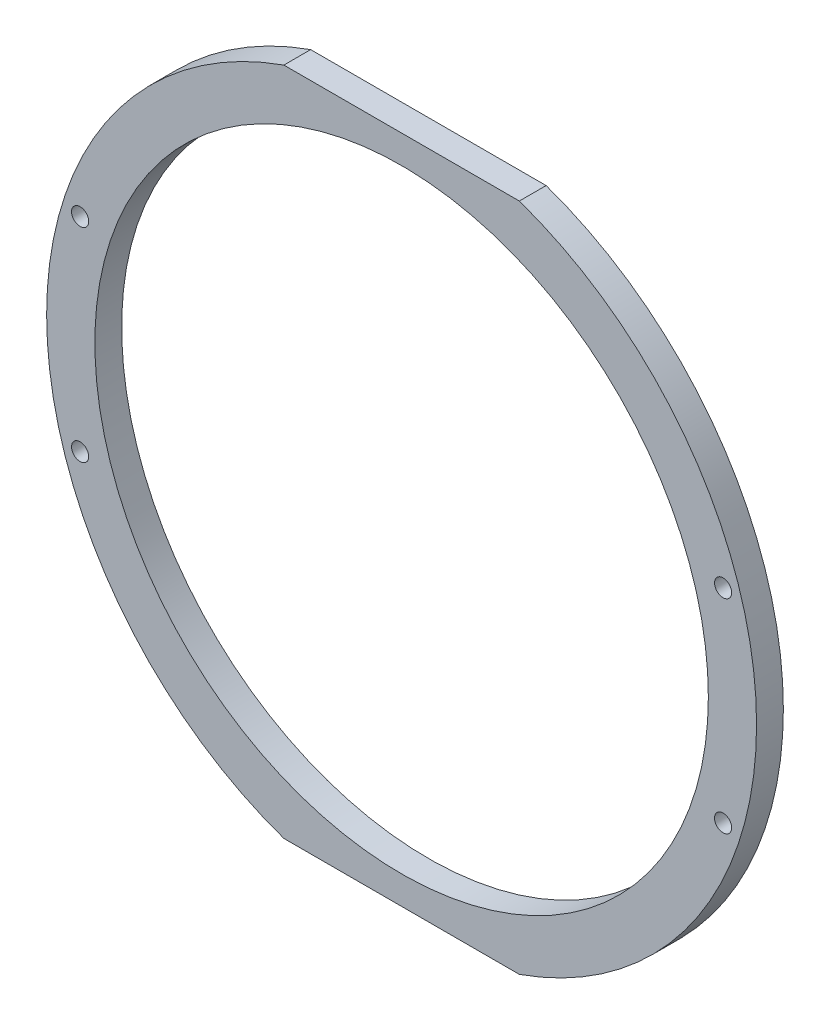
ISO-10303-21;
HEADER;
FILE_DESCRIPTION(('STEP AP214'),'2;1');
FILE_NAME('part.step','',(''),(''),'','','');
FILE_SCHEMA(('AUTOMOTIVE_DESIGN { 1 0 10303 214 1 1 1 1 }'));
ENDSEC;
DATA;
#1=APPLICATION_CONTEXT('core data for automotive mechanical design processes');
#2=APPLICATION_PROTOCOL_DEFINITION('international standard','automotive_design',2000,#1);
#3=PRODUCT_CONTEXT('',#1,'mechanical');
#4=PRODUCT('Part','Part','',(#3));
#5=PRODUCT_RELATED_PRODUCT_CATEGORY('part','',(#4));
#6=PRODUCT_DEFINITION_FORMATION('','',#4);
#7=PRODUCT_DEFINITION_CONTEXT('part definition',#1,'design');
#8=PRODUCT_DEFINITION('design','',#6,#7);
#9=PRODUCT_DEFINITION_SHAPE('','',#8);
#10=(LENGTH_UNIT() NAMED_UNIT(*) SI_UNIT(.MILLI.,.METRE.));
#11=(NAMED_UNIT(*) PLANE_ANGLE_UNIT() SI_UNIT($,.RADIAN.));
#12=(NAMED_UNIT(*) SI_UNIT($,.STERADIAN.) SOLID_ANGLE_UNIT());
#13=UNCERTAINTY_MEASURE_WITH_UNIT(LENGTH_MEASURE(1.E-05),#10,'distance_accuracy_value','');
#14=(GEOMETRIC_REPRESENTATION_CONTEXT(3) GLOBAL_UNCERTAINTY_ASSIGNED_CONTEXT((#13)) GLOBAL_UNIT_ASSIGNED_CONTEXT((#10,
#11,#12)) REPRESENTATION_CONTEXT('',''));
#15=CARTESIAN_POINT('',(0.,0.,0.));
#16=DIRECTION('',(0.,0.,1.));
#17=DIRECTION('',(1.,0.,0.));
#18=AXIS2_PLACEMENT_3D('',#15,#16,#17);
#19=CARTESIAN_POINT('',(0.,0.,5.));
#20=DIRECTION('',(0.,0.,1.));
#21=DIRECTION('',(1.,0.,0.));
#22=AXIS2_PLACEMENT_3D('',#19,#20,#21);
#23=PLANE('',#22);
#24=CARTESIAN_POINT('',(-60.0000000000001,19.,5.));
#25=DIRECTION('',(0.,0.,1.));
#26=DIRECTION('',(1.,0.,0.));
#27=AXIS2_PLACEMENT_3D('',#24,#25,#26);
#28=CIRCLE('',#27,1.60000000000015);
#29=CARTESIAN_POINT('',(-58.4,19.,5.));
#30=VERTEX_POINT('',#29);
#31=EDGE_CURVE('E128',#30,#30,#28,.T.);
#32=ORIENTED_EDGE('',*,*,#31,.F.);
#33=EDGE_LOOP('',(#32));
#34=FACE_BOUND('',#33,.T.);
#35=CARTESIAN_POINT('',(60.,-19.,5.));
#36=DIRECTION('',(0.,0.,1.));
#37=DIRECTION('',(1.,0.,0.));
#38=AXIS2_PLACEMENT_3D('',#35,#36,#37);
#39=CIRCLE('',#38,1.6);
#40=CARTESIAN_POINT('',(61.6,-19.,5.));
#41=VERTEX_POINT('',#40);
#42=EDGE_CURVE('E116',#41,#41,#39,.T.);
#43=ORIENTED_EDGE('',*,*,#42,.F.);
#44=EDGE_LOOP('',(#43));
#45=FACE_BOUND('',#44,.T.);
#46=CARTESIAN_POINT('',(0.,0.,5.));
#47=DIRECTION('',(0.,0.,1.));
#48=DIRECTION('',(1.,0.,0.));
#49=AXIS2_PLACEMENT_3D('',#46,#47,#48);
#50=CIRCLE('',#49,66.25);
#51=CARTESIAN_POINT('',(-21.9729947890586,62.5,5.));
#52=VERTEX_POINT('',#51);
#53=CARTESIAN_POINT('',(-21.9729947890586,-62.5,5.));
#54=VERTEX_POINT('',#53);
#55=EDGE_CURVE('E86',#52,#54,#50,.T.);
#56=ORIENTED_EDGE('',*,*,#55,.T.);
#57=DIRECTION('',(1.,0.,0.));
#58=VECTOR('',#57,1.);
#59=CARTESIAN_POINT('',(-21.9729947890586,-62.5,5.));
#60=LINE('',#59,#58);
#61=CARTESIAN_POINT('',(21.9729947890587,-62.5,5.));
#62=VERTEX_POINT('',#61);
#63=EDGE_CURVE('E81',#54,#62,#60,.T.);
#64=ORIENTED_EDGE('',*,*,#63,.T.);
#65=CARTESIAN_POINT('',(0.,0.,5.));
#66=DIRECTION('',(0.,0.,1.));
#67=DIRECTION('',(-1.,0.,0.));
#68=AXIS2_PLACEMENT_3D('',#65,#66,#67);
#69=CIRCLE('',#68,66.25);
#70=CARTESIAN_POINT('',(21.9729947890586,62.5,5.));
#71=VERTEX_POINT('',#70);
#72=EDGE_CURVE('E84',#62,#71,#69,.T.);
#73=ORIENTED_EDGE('',*,*,#72,.T.);
#74=DIRECTION('',(-1.,0.,0.));
#75=VECTOR('',#74,1.);
#76=CARTESIAN_POINT('',(-21.9729947890586,62.5,5.));
#77=LINE('',#76,#75);
#78=EDGE_CURVE('E51',#71,#52,#77,.T.);
#79=ORIENTED_EDGE('',*,*,#78,.T.);
#80=EDGE_LOOP('',(#56,#64,#73,#79));
#81=FACE_BOUND('',#80,.T.);
#82=CARTESIAN_POINT('',(59.9999999999999,19.,5.));
#83=DIRECTION('',(0.,0.,1.));
#84=DIRECTION('',(1.,0.,0.));
#85=AXIS2_PLACEMENT_3D('',#82,#83,#84);
#86=CIRCLE('',#85,1.60000000000013);
#87=CARTESIAN_POINT('',(61.6,19.,5.));
#88=VERTEX_POINT('',#87);
#89=EDGE_CURVE('E101',#88,#88,#86,.T.);
#90=ORIENTED_EDGE('',*,*,#89,.F.);
#91=EDGE_LOOP('',(#90));
#92=FACE_BOUND('',#91,.T.);
#93=CARTESIAN_POINT('',(-60.,-19.,5.));
#94=DIRECTION('',(0.,0.,1.));
#95=DIRECTION('',(1.,0.,0.));
#96=AXIS2_PLACEMENT_3D('',#93,#94,#95);
#97=CIRCLE('',#96,1.6);
#98=CARTESIAN_POINT('',(-58.4,-19.,5.));
#99=VERTEX_POINT('',#98);
#100=EDGE_CURVE('E122',#99,#99,#97,.T.);
#101=ORIENTED_EDGE('',*,*,#100,.F.);
#102=EDGE_LOOP('',(#101));
#103=FACE_BOUND('',#102,.T.);
#104=CARTESIAN_POINT('',(0.,0.,5.));
#105=DIRECTION('',(0.,0.,1.));
#106=DIRECTION('',(1.,0.,0.));
#107=AXIS2_PLACEMENT_3D('',#104,#105,#106);
#108=CIRCLE('',#107,57.25);
#109=CARTESIAN_POINT('',(57.25,0.,5.));
#110=VERTEX_POINT('',#109);
#111=EDGE_CURVE('E134',#110,#110,#108,.T.);
#112=ORIENTED_EDGE('',*,*,#111,.F.);
#113=EDGE_LOOP('',(#112));
#114=FACE_BOUND('',#113,.T.);
#115=ADVANCED_FACE('F34',(#34,#45,#81,#92,#103,#114),#23,.T.);
#116=CARTESIAN_POINT('',(0.,0.,0.));
#117=DIRECTION('',(0.,0.,1.));
#118=DIRECTION('',(1.,0.,0.));
#119=AXIS2_PLACEMENT_3D('',#116,#117,#118);
#120=PLANE('',#119);
#121=CARTESIAN_POINT('',(0.,0.,0.));
#122=DIRECTION('',(0.,0.,1.));
#123=DIRECTION('',(1.,0.,0.));
#124=AXIS2_PLACEMENT_3D('',#121,#122,#123);
#125=CIRCLE('',#124,66.25);
#126=CARTESIAN_POINT('',(-21.9729947890586,62.5,0.));
#127=VERTEX_POINT('',#126);
#128=CARTESIAN_POINT('',(-21.9729947890586,-62.5,0.));
#129=VERTEX_POINT('',#128);
#130=EDGE_CURVE('E98',#127,#129,#125,.T.);
#131=ORIENTED_EDGE('',*,*,#130,.F.);
#132=DIRECTION('',(-1.,0.,0.));
#133=VECTOR('',#132,1.);
#134=CARTESIAN_POINT('',(-21.9729947890586,62.5,0.));
#135=LINE('',#134,#133);
#136=CARTESIAN_POINT('',(21.9729947890586,62.5,0.));
#137=VERTEX_POINT('',#136);
#138=EDGE_CURVE('E74',#137,#127,#135,.T.);
#139=ORIENTED_EDGE('',*,*,#138,.F.);
#140=CARTESIAN_POINT('',(0.,0.,0.));
#141=DIRECTION('',(0.,0.,1.));
#142=DIRECTION('',(-1.,0.,0.));
#143=AXIS2_PLACEMENT_3D('',#140,#141,#142);
#144=CIRCLE('',#143,66.25);
#145=CARTESIAN_POINT('',(21.9729947890587,-62.5,0.));
#146=VERTEX_POINT('',#145);
#147=EDGE_CURVE('E68',#146,#137,#144,.T.);
#148=ORIENTED_EDGE('',*,*,#147,.F.);
#149=DIRECTION('',(1.,0.,0.));
#150=VECTOR('',#149,1.);
#151=CARTESIAN_POINT('',(-21.9729947890586,-62.5,0.));
#152=LINE('',#151,#150);
#153=EDGE_CURVE('E90',#129,#146,#152,.T.);
#154=ORIENTED_EDGE('',*,*,#153,.F.);
#155=EDGE_LOOP('',(#131,#139,#148,#154));
#156=FACE_BOUND('',#155,.T.);
#157=CARTESIAN_POINT('',(59.9999999999999,19.,0.));
#158=DIRECTION('',(0.,0.,1.));
#159=DIRECTION('',(1.,0.,0.));
#160=AXIS2_PLACEMENT_3D('',#157,#158,#159);
#161=CIRCLE('',#160,1.60000000000013);
#162=CARTESIAN_POINT('',(61.6,19.,0.));
#163=VERTEX_POINT('',#162);
#164=EDGE_CURVE('E113',#163,#163,#161,.T.);
#165=ORIENTED_EDGE('',*,*,#164,.T.);
#166=EDGE_LOOP('',(#165));
#167=FACE_BOUND('',#166,.T.);
#168=CARTESIAN_POINT('',(60.,-19.,0.));
#169=DIRECTION('',(0.,0.,1.));
#170=DIRECTION('',(1.,0.,0.));
#171=AXIS2_PLACEMENT_3D('',#168,#169,#170);
#172=CIRCLE('',#171,1.6);
#173=CARTESIAN_POINT('',(61.6,-19.,0.));
#174=VERTEX_POINT('',#173);
#175=EDGE_CURVE('E119',#174,#174,#172,.T.);
#176=ORIENTED_EDGE('',*,*,#175,.T.);
#177=EDGE_LOOP('',(#176));
#178=FACE_BOUND('',#177,.T.);
#179=CARTESIAN_POINT('',(-60.,-19.,0.));
#180=DIRECTION('',(0.,0.,1.));
#181=DIRECTION('',(1.,0.,0.));
#182=AXIS2_PLACEMENT_3D('',#179,#180,#181);
#183=CIRCLE('',#182,1.6);
#184=CARTESIAN_POINT('',(-58.4,-19.,0.));
#185=VERTEX_POINT('',#184);
#186=EDGE_CURVE('E125',#185,#185,#183,.T.);
#187=ORIENTED_EDGE('',*,*,#186,.T.);
#188=EDGE_LOOP('',(#187));
#189=FACE_BOUND('',#188,.T.);
#190=CARTESIAN_POINT('',(-60.0000000000001,19.,0.));
#191=DIRECTION('',(0.,0.,1.));
#192=DIRECTION('',(1.,0.,0.));
#193=AXIS2_PLACEMENT_3D('',#190,#191,#192);
#194=CIRCLE('',#193,1.60000000000015);
#195=CARTESIAN_POINT('',(-58.4,19.,0.));
#196=VERTEX_POINT('',#195);
#197=EDGE_CURVE('E131',#196,#196,#194,.T.);
#198=ORIENTED_EDGE('',*,*,#197,.T.);
#199=EDGE_LOOP('',(#198));
#200=FACE_BOUND('',#199,.T.);
#201=CARTESIAN_POINT('',(0.,0.,0.));
#202=DIRECTION('',(0.,0.,1.));
#203=DIRECTION('',(1.,0.,0.));
#204=AXIS2_PLACEMENT_3D('',#201,#202,#203);
#205=CIRCLE('',#204,57.25);
#206=CARTESIAN_POINT('',(57.25,0.,0.));
#207=VERTEX_POINT('',#206);
#208=EDGE_CURVE('E137',#207,#207,#205,.T.);
#209=ORIENTED_EDGE('',*,*,#208,.T.);
#210=EDGE_LOOP('',(#209));
#211=FACE_BOUND('',#210,.T.);
#212=ADVANCED_FACE('F109',(#156,#167,#178,#189,#200,#211),#120,.F.);
#213=CARTESIAN_POINT('',(0.,0.,5.));
#214=DIRECTION('',(0.,0.,-1.));
#215=DIRECTION('',(-1.,0.,0.));
#216=AXIS2_PLACEMENT_3D('',#213,#214,#215);
#217=CYLINDRICAL_SURFACE('',#216,66.25);
#218=ORIENTED_EDGE('',*,*,#130,.T.);
#219=DIRECTION('',(0.,0.,-1.));
#220=VECTOR('',#219,1.);
#221=CARTESIAN_POINT('',(-21.9729947890586,-62.5,5.));
#222=LINE('',#221,#220);
#223=EDGE_CURVE('E11',#54,#129,#222,.T.);
#224=ORIENTED_EDGE('',*,*,#223,.F.);
#225=ORIENTED_EDGE('',*,*,#55,.F.);
#226=DIRECTION('',(0.,0.,-1.));
#227=VECTOR('',#226,1.);
#228=CARTESIAN_POINT('',(-21.9729947890586,62.5,5.));
#229=LINE('',#228,#227);
#230=EDGE_CURVE('E94',#52,#127,#229,.T.);
#231=ORIENTED_EDGE('',*,*,#230,.T.);
#232=EDGE_LOOP('',(#218,#224,#225,#231));
#233=FACE_BOUND('',#232,.T.);
#234=ADVANCED_FACE('F36',(#233),#217,.T.);
#235=CARTESIAN_POINT('',(-21.9729947890586,-62.5,5.));
#236=DIRECTION('',(0.,1.,0.));
#237=DIRECTION('',(0.,0.,1.));
#238=AXIS2_PLACEMENT_3D('',#235,#236,#237);
#239=PLANE('',#238);
#240=ORIENTED_EDGE('',*,*,#153,.T.);
#241=DIRECTION('',(0.,0.,-1.));
#242=VECTOR('',#241,1.);
#243=CARTESIAN_POINT('',(21.9729947890587,-62.5,5.));
#244=LINE('',#243,#242);
#245=EDGE_CURVE('E43',#62,#146,#244,.T.);
#246=ORIENTED_EDGE('',*,*,#245,.F.);
#247=ORIENTED_EDGE('',*,*,#63,.F.);
#248=ORIENTED_EDGE('',*,*,#223,.T.);
#249=EDGE_LOOP('',(#240,#246,#247,#248));
#250=FACE_BOUND('',#249,.T.);
#251=ADVANCED_FACE('F89',(#250),#239,.F.);
#252=CARTESIAN_POINT('',(0.,0.,5.));
#253=DIRECTION('',(0.,0.,-1.));
#254=DIRECTION('',(-1.,0.,0.));
#255=AXIS2_PLACEMENT_3D('',#252,#253,#254);
#256=CYLINDRICAL_SURFACE('',#255,66.25);
#257=ORIENTED_EDGE('',*,*,#147,.T.);
#258=DIRECTION('',(0.,0.,-1.));
#259=VECTOR('',#258,1.);
#260=CARTESIAN_POINT('',(21.9729947890586,62.5,5.));
#261=LINE('',#260,#259);
#262=EDGE_CURVE('E91',#71,#137,#261,.T.);
#263=ORIENTED_EDGE('',*,*,#262,.F.);
#264=ORIENTED_EDGE('',*,*,#72,.F.);
#265=ORIENTED_EDGE('',*,*,#245,.T.);
#266=EDGE_LOOP('',(#257,#263,#264,#265));
#267=FACE_BOUND('',#266,.T.);
#268=ADVANCED_FACE('F92',(#267),#256,.T.);
#269=CARTESIAN_POINT('',(-21.9729947890586,62.5,5.));
#270=DIRECTION('',(0.,-1.,0.));
#271=DIRECTION('',(0.,0.,-1.));
#272=AXIS2_PLACEMENT_3D('',#269,#270,#271);
#273=PLANE('',#272);
#274=ORIENTED_EDGE('',*,*,#138,.T.);
#275=ORIENTED_EDGE('',*,*,#230,.F.);
#276=ORIENTED_EDGE('',*,*,#78,.F.);
#277=ORIENTED_EDGE('',*,*,#262,.T.);
#278=EDGE_LOOP('',(#274,#275,#276,#277));
#279=FACE_BOUND('',#278,.T.);
#280=ADVANCED_FACE('F106',(#279),#273,.F.);
#281=CARTESIAN_POINT('',(59.9999999999999,19.,5.));
#282=DIRECTION('',(0.,0.,-1.));
#283=DIRECTION('',(-1.,0.,0.));
#284=AXIS2_PLACEMENT_3D('',#281,#282,#283);
#285=CYLINDRICAL_SURFACE('',#284,1.60000000000013);
#286=ORIENTED_EDGE('',*,*,#89,.T.);
#287=EDGE_LOOP('',(#286));
#288=FACE_BOUND('',#287,.T.);
#289=ORIENTED_EDGE('',*,*,#164,.F.);
#290=EDGE_LOOP('',(#289));
#291=FACE_BOUND('',#290,.T.);
#292=ADVANCED_FACE('F156',(#288,#291),#285,.F.);
#293=CARTESIAN_POINT('',(60.,-19.,5.));
#294=DIRECTION('',(0.,0.,-1.));
#295=DIRECTION('',(-1.,0.,0.));
#296=AXIS2_PLACEMENT_3D('',#293,#294,#295);
#297=CYLINDRICAL_SURFACE('',#296,1.6);
#298=ORIENTED_EDGE('',*,*,#42,.T.);
#299=EDGE_LOOP('',(#298));
#300=FACE_BOUND('',#299,.T.);
#301=ORIENTED_EDGE('',*,*,#175,.F.);
#302=EDGE_LOOP('',(#301));
#303=FACE_BOUND('',#302,.T.);
#304=ADVANCED_FACE('F202',(#300,#303),#297,.F.);
#305=CARTESIAN_POINT('',(-60.,-19.,5.));
#306=DIRECTION('',(0.,0.,-1.));
#307=DIRECTION('',(-1.,0.,0.));
#308=AXIS2_PLACEMENT_3D('',#305,#306,#307);
#309=CYLINDRICAL_SURFACE('',#308,1.6);
#310=ORIENTED_EDGE('',*,*,#100,.T.);
#311=EDGE_LOOP('',(#310));
#312=FACE_BOUND('',#311,.T.);
#313=ORIENTED_EDGE('',*,*,#186,.F.);
#314=EDGE_LOOP('',(#313));
#315=FACE_BOUND('',#314,.T.);
#316=ADVANCED_FACE('F210',(#312,#315),#309,.F.);
#317=CARTESIAN_POINT('',(-60.0000000000001,19.,5.));
#318=DIRECTION('',(0.,0.,-1.));
#319=DIRECTION('',(-1.,0.,0.));
#320=AXIS2_PLACEMENT_3D('',#317,#318,#319);
#321=CYLINDRICAL_SURFACE('',#320,1.60000000000015);
#322=ORIENTED_EDGE('',*,*,#31,.T.);
#323=EDGE_LOOP('',(#322));
#324=FACE_BOUND('',#323,.T.);
#325=ORIENTED_EDGE('',*,*,#197,.F.);
#326=EDGE_LOOP('',(#325));
#327=FACE_BOUND('',#326,.T.);
#328=ADVANCED_FACE('F218',(#324,#327),#321,.F.);
#329=CARTESIAN_POINT('',(0.,0.,5.));
#330=DIRECTION('',(0.,0.,-1.));
#331=DIRECTION('',(-1.,0.,0.));
#332=AXIS2_PLACEMENT_3D('',#329,#330,#331);
#333=CYLINDRICAL_SURFACE('',#332,57.25);
#334=ORIENTED_EDGE('',*,*,#111,.T.);
#335=EDGE_LOOP('',(#334));
#336=FACE_BOUND('',#335,.T.);
#337=ORIENTED_EDGE('',*,*,#208,.F.);
#338=EDGE_LOOP('',(#337));
#339=FACE_BOUND('',#338,.T.);
#340=ADVANCED_FACE('F143',(#336,#339),#333,.F.);
#341=CLOSED_SHELL('',(#115,#212,#234,#251,#268,#280,#292,#304,#316,#328,#340));
#342=MANIFOLD_SOLID_BREP('B2',#341);
#343=ADVANCED_BREP_SHAPE_REPRESENTATION('',(#18,#342),#14);
#344=SHAPE_DEFINITION_REPRESENTATION(#9,#343);
ENDSEC;
END-ISO-10303-21;
